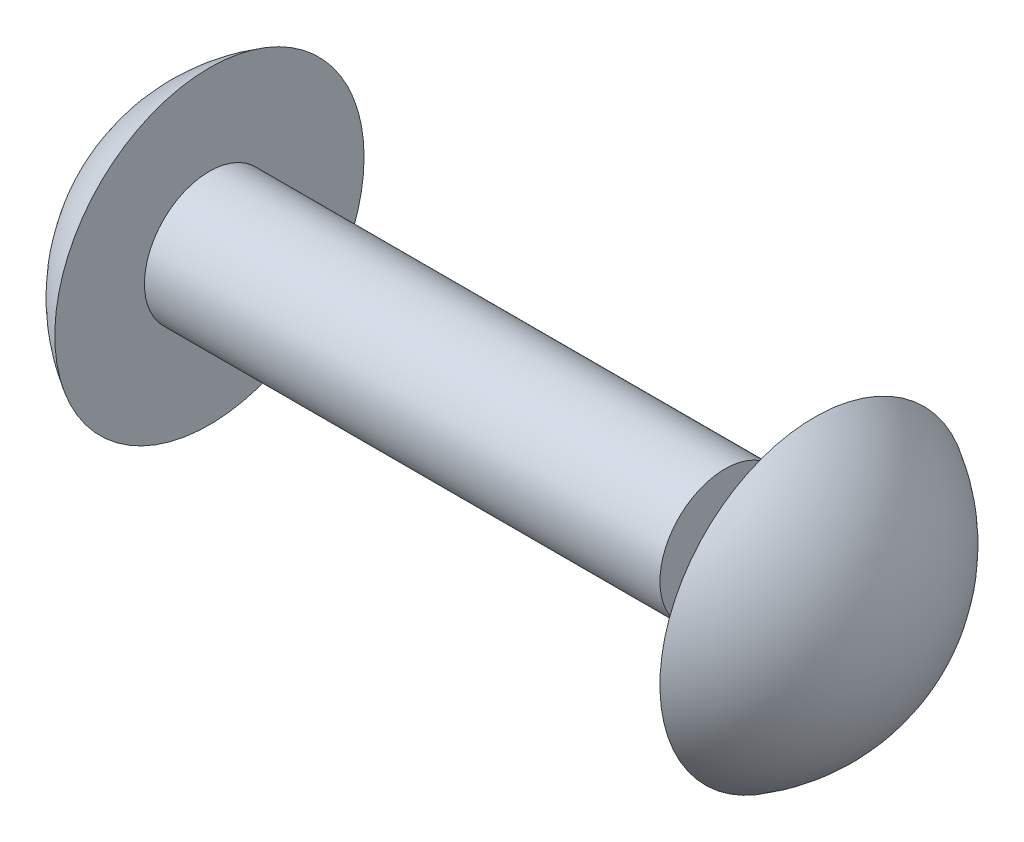
ISO-10303-21;
HEADER;
FILE_DESCRIPTION(('STEP AP214'),'2;1');
FILE_NAME('part.step','',(''),(''),'','','');
FILE_SCHEMA(('AUTOMOTIVE_DESIGN { 1 0 10303 214 1 1 1 1 }'));
ENDSEC;
DATA;
#1=APPLICATION_CONTEXT('core data for automotive mechanical design processes');
#2=APPLICATION_PROTOCOL_DEFINITION('international standard','automotive_design',2000,#1);
#3=PRODUCT_CONTEXT('',#1,'mechanical');
#4=PRODUCT('Part','Part','',(#3));
#5=PRODUCT_RELATED_PRODUCT_CATEGORY('part','',(#4));
#6=PRODUCT_DEFINITION_FORMATION('','',#4);
#7=PRODUCT_DEFINITION_CONTEXT('part definition',#1,'design');
#8=PRODUCT_DEFINITION('design','',#6,#7);
#9=PRODUCT_DEFINITION_SHAPE('','',#8);
#10=(LENGTH_UNIT() NAMED_UNIT(*) SI_UNIT(.MILLI.,.METRE.));
#11=(NAMED_UNIT(*) PLANE_ANGLE_UNIT() SI_UNIT($,.RADIAN.));
#12=(NAMED_UNIT(*) SI_UNIT($,.STERADIAN.) SOLID_ANGLE_UNIT());
#13=UNCERTAINTY_MEASURE_WITH_UNIT(LENGTH_MEASURE(1.E-05),#10,'distance_accuracy_value','');
#14=(GEOMETRIC_REPRESENTATION_CONTEXT(3) GLOBAL_UNCERTAINTY_ASSIGNED_CONTEXT((#13)) GLOBAL_UNIT_ASSIGNED_CONTEXT((#10,
#11,#12)) REPRESENTATION_CONTEXT('',''));
#15=CARTESIAN_POINT('',(0.,0.,0.));
#16=DIRECTION('',(0.,0.,1.));
#17=DIRECTION('',(1.,0.,0.));
#18=AXIS2_PLACEMENT_3D('',#15,#16,#17);
#19=CARTESIAN_POINT('',(5.774375,0.,0.));
#20=DIRECTION('',(-1.,0.,0.));
#21=DIRECTION('',(0.,-1.,0.));
#22=AXIS2_PLACEMENT_3D('',#19,#20,#21);
#23=SPHERICAL_SURFACE('',#22,3.975625);
#24=CARTESIAN_POINT('',(7.75,0.,0.));
#25=DIRECTION('',(-1.,0.,0.));
#26=DIRECTION('',(0.,0.,-1.));
#27=AXIS2_PLACEMENT_3D('',#24,#25,#26);
#28=CIRCLE('',#27,3.45);
#29=CARTESIAN_POINT('',(7.75,0.,-3.45));
#30=VERTEX_POINT('',#29);
#31=EDGE_CURVE('E11',#30,#30,#28,.T.);
#32=ORIENTED_EDGE('',*,*,#31,.F.);
#33=EDGE_LOOP('',(#32));
#34=FACE_BOUND('',#33,.T.);
#35=ADVANCED_FACE('F51',(#34),#23,.T.);
#36=CARTESIAN_POINT('',(7.75,-3.45,0.));
#37=DIRECTION('',(-1.,0.,0.));
#38=DIRECTION('',(0.,0.,-1.));
#39=AXIS2_PLACEMENT_3D('',#36,#37,#38);
#40=PLANE('',#39);
#41=ORIENTED_EDGE('',*,*,#31,.T.);
#42=EDGE_LOOP('',(#41));
#43=FACE_BOUND('',#42,.T.);
#44=ADVANCED_FACE('F58',(#43),#40,.T.);
#45=CLOSED_SHELL('',(#35,#44));
#46=MANIFOLD_SOLID_BREP('B2',#45);
#47=CARTESIAN_POINT('',(-3.774375,0.,0.));
#48=DIRECTION('',(1.,0.,0.));
#49=DIRECTION('',(0.,1.,0.));
#50=AXIS2_PLACEMENT_3D('',#47,#48,#49);
#51=SPHERICAL_SURFACE('',#50,3.975625);
#52=CARTESIAN_POINT('',(-5.75,0.,0.));
#53=DIRECTION('',(1.,0.,0.));
#54=DIRECTION('',(0.,0.,-1.));
#55=AXIS2_PLACEMENT_3D('',#52,#53,#54);
#56=CIRCLE('',#55,3.45);
#57=CARTESIAN_POINT('',(-5.75,0.,-3.45));
#58=VERTEX_POINT('',#57);
#59=EDGE_CURVE('E50',#58,#58,#56,.T.);
#60=ORIENTED_EDGE('',*,*,#59,.F.);
#61=EDGE_LOOP('',(#60));
#62=FACE_BOUND('',#61,.T.);
#63=ADVANCED_FACE('F83',(#62),#51,.T.);
#64=CARTESIAN_POINT('',(-5.75,3.45,0.));
#65=DIRECTION('',(1.,0.,0.));
#66=DIRECTION('',(0.,0.,-1.));
#67=AXIS2_PLACEMENT_3D('',#64,#65,#66);
#68=PLANE('',#67);
#69=ORIENTED_EDGE('',*,*,#59,.T.);
#70=EDGE_LOOP('',(#69));
#71=FACE_BOUND('',#70,.T.);
#72=ADVANCED_FACE('F90',(#71),#68,.T.);
#73=CLOSED_SHELL('',(#63,#72));
#74=MANIFOLD_SOLID_BREP('B6',#73);
#75=CARTESIAN_POINT('',(5.75,0.,0.));
#76=DIRECTION('',(-1.,0.,0.));
#77=DIRECTION('',(0.,0.,1.));
#78=AXIS2_PLACEMENT_3D('',#75,#76,#77);
#79=CYLINDRICAL_SURFACE('',#78,1.45);
#80=CARTESIAN_POINT('',(5.75,0.,0.));
#81=DIRECTION('',(1.,0.,0.));
#82=DIRECTION('',(0.,0.,-1.));
#83=AXIS2_PLACEMENT_3D('',#80,#81,#82);
#84=CIRCLE('',#83,1.45);
#85=CARTESIAN_POINT('',(5.75,0.,-1.45));
#86=VERTEX_POINT('',#85);
#87=EDGE_CURVE('E82',#86,#86,#84,.T.);
#88=ORIENTED_EDGE('',*,*,#87,.F.);
#89=EDGE_LOOP('',(#88));
#90=FACE_BOUND('',#89,.T.);
#91=CARTESIAN_POINT('',(-5.75,0.,0.));
#92=DIRECTION('',(1.,0.,0.));
#93=DIRECTION('',(0.,0.,-1.));
#94=AXIS2_PLACEMENT_3D('',#91,#92,#93);
#95=CIRCLE('',#94,1.45);
#96=CARTESIAN_POINT('',(-5.75,0.,-1.45));
#97=VERTEX_POINT('',#96);
#98=EDGE_CURVE('E111',#97,#97,#95,.T.);
#99=ORIENTED_EDGE('',*,*,#98,.T.);
#100=EDGE_LOOP('',(#99));
#101=FACE_BOUND('',#100,.T.);
#102=ADVANCED_FACE('F108',(#90,#101),#79,.T.);
#103=CARTESIAN_POINT('',(5.75,0.,0.));
#104=DIRECTION('',(1.,0.,0.));
#105=DIRECTION('',(0.,0.,-1.));
#106=AXIS2_PLACEMENT_3D('',#103,#104,#105);
#107=PLANE('',#106);
#108=ORIENTED_EDGE('',*,*,#87,.T.);
#109=EDGE_LOOP('',(#108));
#110=FACE_BOUND('',#109,.T.);
#111=ADVANCED_FACE('F125',(#110),#107,.T.);
#112=CARTESIAN_POINT('',(-5.75,0.,0.));
#113=DIRECTION('',(1.,0.,0.));
#114=DIRECTION('',(0.,0.,-1.));
#115=AXIS2_PLACEMENT_3D('',#112,#113,#114);
#116=PLANE('',#115);
#117=ORIENTED_EDGE('',*,*,#98,.F.);
#118=EDGE_LOOP('',(#117));
#119=FACE_BOUND('',#118,.T.);
#120=ADVANCED_FACE('F123',(#119),#116,.F.);
#121=CLOSED_SHELL('',(#102,#111,#120));
#122=MANIFOLD_SOLID_BREP('B45',#121);
#123=ADVANCED_BREP_SHAPE_REPRESENTATION('',(#18,#46,#74,#122),#14);
#124=SHAPE_DEFINITION_REPRESENTATION(#9,#123);
ENDSEC;
END-ISO-10303-21;
